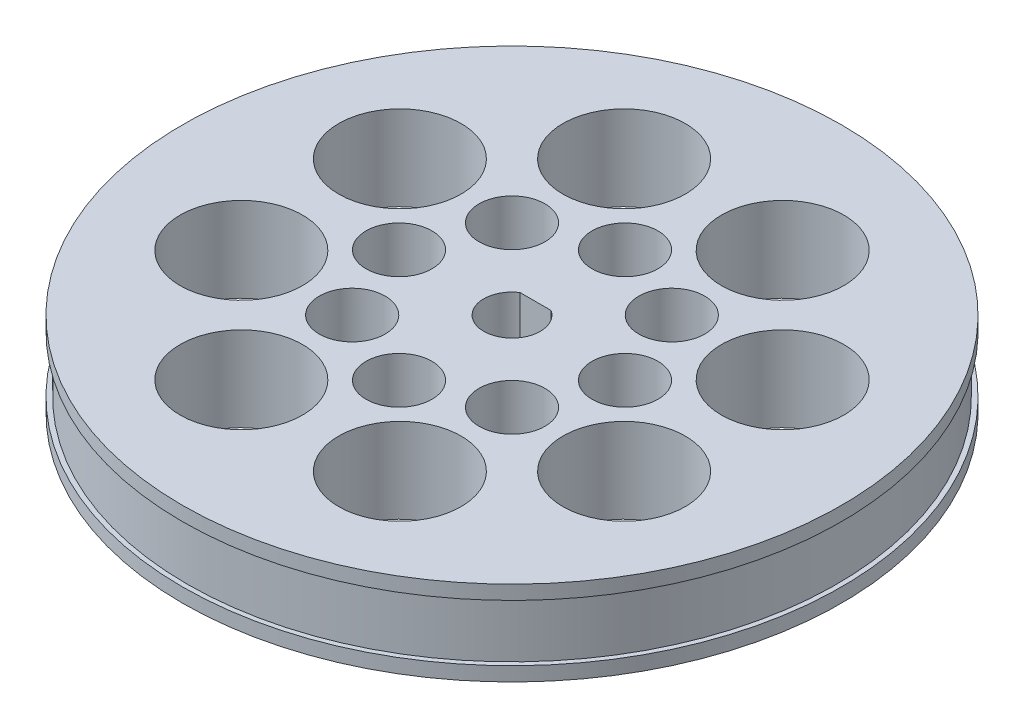
ISO-10303-21;
HEADER;
FILE_DESCRIPTION(('STEP AP214'),'2;1');
FILE_NAME('part.step','',(''),(''),'','','');
FILE_SCHEMA(('AUTOMOTIVE_DESIGN { 1 0 10303 214 1 1 1 1 }'));
ENDSEC;
DATA;
#1=APPLICATION_CONTEXT('core data for automotive mechanical design processes');
#2=APPLICATION_PROTOCOL_DEFINITION('international standard','automotive_design',2000,#1);
#3=PRODUCT_CONTEXT('',#1,'mechanical');
#4=PRODUCT('Part','Part','',(#3));
#5=PRODUCT_RELATED_PRODUCT_CATEGORY('part','',(#4));
#6=PRODUCT_DEFINITION_FORMATION('','',#4);
#7=PRODUCT_DEFINITION_CONTEXT('part definition',#1,'design');
#8=PRODUCT_DEFINITION('design','',#6,#7);
#9=PRODUCT_DEFINITION_SHAPE('','',#8);
#10=(LENGTH_UNIT() NAMED_UNIT(*) SI_UNIT(.MILLI.,.METRE.));
#11=(NAMED_UNIT(*) PLANE_ANGLE_UNIT() SI_UNIT($,.RADIAN.));
#12=(NAMED_UNIT(*) SI_UNIT($,.STERADIAN.) SOLID_ANGLE_UNIT());
#13=UNCERTAINTY_MEASURE_WITH_UNIT(LENGTH_MEASURE(1.E-05),#10,'distance_accuracy_value','');
#14=(GEOMETRIC_REPRESENTATION_CONTEXT(3) GLOBAL_UNCERTAINTY_ASSIGNED_CONTEXT((#13)) GLOBAL_UNIT_ASSIGNED_CONTEXT((#10,
#11,#12)) REPRESENTATION_CONTEXT('',''));
#15=CARTESIAN_POINT('',(0.,0.,0.));
#16=DIRECTION('',(0.,0.,1.));
#17=DIRECTION('',(1.,0.,0.));
#18=AXIS2_PLACEMENT_3D('',#15,#16,#17);
#19=CARTESIAN_POINT('',(0.,9.,0.));
#20=DIRECTION('',(0.,-1.,0.));
#21=DIRECTION('',(0.,0.,-1.));
#22=AXIS2_PLACEMENT_3D('',#19,#20,#21);
#23=CYLINDRICAL_SURFACE('',#22,35.);
#24=CARTESIAN_POINT('',(0.,9.,0.));
#25=DIRECTION('',(0.,1.,0.));
#26=DIRECTION('',(0.,0.,1.));
#27=AXIS2_PLACEMENT_3D('',#24,#25,#26);
#28=CIRCLE('',#27,35.);
#29=CARTESIAN_POINT('',(0.,9.,35.));
#30=VERTEX_POINT('',#29);
#31=EDGE_CURVE('E11',#30,#30,#28,.T.);
#32=ORIENTED_EDGE('',*,*,#31,.F.);
#33=EDGE_LOOP('',(#32));
#34=FACE_BOUND('',#33,.T.);
#35=CARTESIAN_POINT('',(0.,7.5,0.));
#36=DIRECTION('',(0.,-1.,0.));
#37=DIRECTION('',(0.,0.,-1.));
#38=AXIS2_PLACEMENT_3D('',#35,#36,#37);
#39=CIRCLE('',#38,35.);
#40=CARTESIAN_POINT('',(0.,7.5,-35.));
#41=VERTEX_POINT('',#40);
#42=EDGE_CURVE('E37',#41,#41,#39,.T.);
#43=ORIENTED_EDGE('',*,*,#42,.F.);
#44=EDGE_LOOP('',(#43));
#45=FACE_BOUND('',#44,.T.);
#46=ADVANCED_FACE('F34',(#34,#45),#23,.T.);
#47=CARTESIAN_POINT('',(0.,0.,0.));
#48=DIRECTION('',(0.,1.,0.));
#49=DIRECTION('',(0.,0.,1.));
#50=AXIS2_PLACEMENT_3D('',#47,#48,#49);
#51=CIRCLE('',#50,35.);
#52=CARTESIAN_POINT('',(0.,0.,35.));
#53=VERTEX_POINT('',#52);
#54=EDGE_CURVE('E42',#53,#53,#51,.T.);
#55=ORIENTED_EDGE('',*,*,#54,.T.);
#56=EDGE_LOOP('',(#55));
#57=FACE_BOUND('',#56,.T.);
#58=CARTESIAN_POINT('',(0.,1.5,0.));
#59=DIRECTION('',(0.,1.,0.));
#60=DIRECTION('',(0.,0.,1.));
#61=AXIS2_PLACEMENT_3D('',#58,#59,#60);
#62=CIRCLE('',#61,35.);
#63=CARTESIAN_POINT('',(0.,1.5,35.));
#64=VERTEX_POINT('',#63);
#65=EDGE_CURVE('E87',#64,#64,#62,.T.);
#66=ORIENTED_EDGE('',*,*,#65,.F.);
#67=EDGE_LOOP('',(#66));
#68=FACE_BOUND('',#67,.T.);
#69=ADVANCED_FACE('F199',(#57,#68),#23,.T.);
#70=CARTESIAN_POINT('',(0.,9.,0.));
#71=DIRECTION('',(0.,1.,0.));
#72=DIRECTION('',(0.,0.,1.));
#73=AXIS2_PLACEMENT_3D('',#70,#71,#72);
#74=PLANE('',#73);
#75=CARTESIAN_POINT('',(-12.,9.,0.));
#76=DIRECTION('',(0.,1.,0.));
#77=DIRECTION('',(0.,0.,1.));
#78=AXIS2_PLACEMENT_3D('',#75,#76,#77);
#79=CIRCLE('',#78,3.5);
#80=CARTESIAN_POINT('',(-12.,9.,3.49999999999992));
#81=VERTEX_POINT('',#80);
#82=EDGE_CURVE('E75',#81,#81,#79,.T.);
#83=ORIENTED_EDGE('',*,*,#82,.F.);
#84=EDGE_LOOP('',(#83));
#85=FACE_BOUND('',#84,.T.);
#86=CARTESIAN_POINT('',(-20.3253497152483,9.,8.419035512032));
#87=DIRECTION('',(0.,1.,0.));
#88=DIRECTION('',(0.,0.,1.));
#89=AXIS2_PLACEMENT_3D('',#86,#87,#88);
#90=CIRCLE('',#89,6.5);
#91=CARTESIAN_POINT('',(-20.3253497152483,9.,14.919035512032));
#92=VERTEX_POINT('',#91);
#93=EDGE_CURVE('E78',#92,#92,#90,.T.);
#94=ORIENTED_EDGE('',*,*,#93,.F.);
#95=EDGE_LOOP('',(#94));
#96=FACE_BOUND('',#95,.T.);
#97=CARTESIAN_POINT('',(-20.3253497152483,9.,-8.41903551203198));
#98=DIRECTION('',(0.,1.,0.));
#99=DIRECTION('',(0.,0.,1.));
#100=AXIS2_PLACEMENT_3D('',#97,#98,#99);
#101=CIRCLE('',#100,6.5);
#102=CARTESIAN_POINT('',(-20.3253497152483,9.,-1.91903551203198));
#103=VERTEX_POINT('',#102);
#104=EDGE_CURVE('E188',#103,#103,#101,.T.);
#105=ORIENTED_EDGE('',*,*,#104,.F.);
#106=EDGE_LOOP('',(#105));
#107=FACE_BOUND('',#106,.T.);
#108=CARTESIAN_POINT('',(-8.4852813742385,9.,-8.48528137423864));
#109=DIRECTION('',(0.,1.,0.));
#110=DIRECTION('',(0.,0.,1.));
#111=AXIS2_PLACEMENT_3D('',#108,#109,#110);
#112=CIRCLE('',#111,3.5);
#113=CARTESIAN_POINT('',(-8.4852813742385,9.,-4.98528137423864));
#114=VERTEX_POINT('',#113);
#115=EDGE_CURVE('E185',#114,#114,#112,.T.);
#116=ORIENTED_EDGE('',*,*,#115,.F.);
#117=EDGE_LOOP('',(#116));
#118=FACE_BOUND('',#117,.T.);
#119=CARTESIAN_POINT('',(0.,9.,12.));
#120=DIRECTION('',(0.,1.,0.));
#121=DIRECTION('',(0.,0.,1.));
#122=AXIS2_PLACEMENT_3D('',#119,#120,#121);
#123=CIRCLE('',#122,3.5);
#124=CARTESIAN_POINT('',(0.,9.,15.5));
#125=VERTEX_POINT('',#124);
#126=EDGE_CURVE('E182',#125,#125,#123,.T.);
#127=ORIENTED_EDGE('',*,*,#126,.F.);
#128=EDGE_LOOP('',(#127));
#129=FACE_BOUND('',#128,.T.);
#130=CARTESIAN_POINT('',(8.41903551203207,9.,20.3253497152483));
#131=DIRECTION('',(0.,1.,0.));
#132=DIRECTION('',(0.,0.,1.));
#133=AXIS2_PLACEMENT_3D('',#130,#131,#132);
#134=CIRCLE('',#133,6.5);
#135=CARTESIAN_POINT('',(8.41903551203207,9.,26.8253497152483));
#136=VERTEX_POINT('',#135);
#137=EDGE_CURVE('E179',#136,#136,#134,.T.);
#138=ORIENTED_EDGE('',*,*,#137,.F.);
#139=EDGE_LOOP('',(#138));
#140=FACE_BOUND('',#139,.T.);
#141=CARTESIAN_POINT('',(-8.41903551203191,9.,20.3253497152483));
#142=DIRECTION('',(0.,1.,0.));
#143=DIRECTION('',(0.,0.,1.));
#144=AXIS2_PLACEMENT_3D('',#141,#142,#143);
#145=CIRCLE('',#144,6.5);
#146=CARTESIAN_POINT('',(-8.41903551203191,9.,26.8253497152483));
#147=VERTEX_POINT('',#146);
#148=EDGE_CURVE('E176',#147,#147,#145,.T.);
#149=ORIENTED_EDGE('',*,*,#148,.F.);
#150=EDGE_LOOP('',(#149));
#151=FACE_BOUND('',#150,.T.);
#152=CARTESIAN_POINT('',(-8.48528137423861,9.,8.48528137423853));
#153=DIRECTION('',(0.,1.,0.));
#154=DIRECTION('',(0.,0.,1.));
#155=AXIS2_PLACEMENT_3D('',#152,#153,#154);
#156=CIRCLE('',#155,3.5);
#157=CARTESIAN_POINT('',(-8.48528137423861,9.,11.9852813742385));
#158=VERTEX_POINT('',#157);
#159=EDGE_CURVE('E173',#158,#158,#156,.T.);
#160=ORIENTED_EDGE('',*,*,#159,.F.);
#161=EDGE_LOOP('',(#160));
#162=FACE_BOUND('',#161,.T.);
#163=CARTESIAN_POINT('',(12.,9.,1.63931368479808E-13));
#164=DIRECTION('',(0.,1.,0.));
#165=DIRECTION('',(0.,0.,1.));
#166=AXIS2_PLACEMENT_3D('',#163,#164,#165);
#167=CIRCLE('',#166,3.5);
#168=CARTESIAN_POINT('',(12.,9.,3.50000000000017));
#169=VERTEX_POINT('',#168);
#170=EDGE_CURVE('E170',#169,#169,#167,.T.);
#171=ORIENTED_EDGE('',*,*,#170,.F.);
#172=EDGE_LOOP('',(#171));
#173=FACE_BOUND('',#172,.T.);
#174=CARTESIAN_POINT('',(20.3253497152484,9.,-8.41903551203186));
#175=DIRECTION('',(0.,1.,0.));
#176=DIRECTION('',(0.,0.,1.));
#177=AXIS2_PLACEMENT_3D('',#174,#175,#176);
#178=CIRCLE('',#177,6.5);
#179=CARTESIAN_POINT('',(20.3253497152484,9.,-1.91903551203185));
#180=VERTEX_POINT('',#179);
#181=EDGE_CURVE('E167',#180,#180,#178,.T.);
#182=ORIENTED_EDGE('',*,*,#181,.F.);
#183=EDGE_LOOP('',(#182));
#184=FACE_BOUND('',#183,.T.);
#185=CARTESIAN_POINT('',(20.3253497152482,9.,8.41903551203212));
#186=DIRECTION('',(0.,1.,0.));
#187=DIRECTION('',(0.,0.,1.));
#188=AXIS2_PLACEMENT_3D('',#185,#186,#187);
#189=CIRCLE('',#188,6.5);
#190=CARTESIAN_POINT('',(20.3253497152482,9.,14.9190355120321));
#191=VERTEX_POINT('',#190);
#192=EDGE_CURVE('E164',#191,#191,#189,.T.);
#193=ORIENTED_EDGE('',*,*,#192,.F.);
#194=EDGE_LOOP('',(#193));
#195=FACE_BOUND('',#194,.T.);
#196=CARTESIAN_POINT('',(1.24032728532342E-13,9.,-12.));
#197=DIRECTION('',(0.,1.,0.));
#198=DIRECTION('',(0.,0.,1.));
#199=AXIS2_PLACEMENT_3D('',#196,#197,#198);
#200=CIRCLE('',#199,3.5);
#201=CARTESIAN_POINT('',(1.24032728532342E-13,9.,-8.5));
#202=VERTEX_POINT('',#201);
#203=EDGE_CURVE('E161',#202,#202,#200,.T.);
#204=ORIENTED_EDGE('',*,*,#203,.F.);
#205=EDGE_LOOP('',(#204));
#206=FACE_BOUND('',#205,.T.);
#207=CARTESIAN_POINT('',(-8.41903551203193,9.,-20.3253497152483));
#208=DIRECTION('',(0.,1.,0.));
#209=DIRECTION('',(0.,0.,1.));
#210=AXIS2_PLACEMENT_3D('',#207,#208,#209);
#211=CIRCLE('',#210,6.5);
#212=CARTESIAN_POINT('',(-8.41903551203193,9.,-13.8253497152483));
#213=VERTEX_POINT('',#212);
#214=EDGE_CURVE('E158',#213,#213,#211,.T.);
#215=ORIENTED_EDGE('',*,*,#214,.F.);
#216=EDGE_LOOP('',(#215));
#217=FACE_BOUND('',#216,.T.);
#218=CARTESIAN_POINT('',(8.41903551203205,9.,-20.3253497152483));
#219=DIRECTION('',(0.,1.,0.));
#220=DIRECTION('',(0.,0.,1.));
#221=AXIS2_PLACEMENT_3D('',#218,#219,#220);
#222=CIRCLE('',#221,6.5);
#223=CARTESIAN_POINT('',(8.41903551203205,9.,-13.8253497152483));
#224=VERTEX_POINT('',#223);
#225=EDGE_CURVE('E155',#224,#224,#222,.T.);
#226=ORIENTED_EDGE('',*,*,#225,.F.);
#227=EDGE_LOOP('',(#226));
#228=FACE_BOUND('',#227,.T.);
#229=CARTESIAN_POINT('',(8.48528137423867,9.,-8.48528137423847));
#230=DIRECTION('',(0.,1.,0.));
#231=DIRECTION('',(0.,0.,1.));
#232=AXIS2_PLACEMENT_3D('',#229,#230,#231);
#233=CIRCLE('',#232,3.5);
#234=CARTESIAN_POINT('',(8.48528137423867,9.,-4.98528137423847));
#235=VERTEX_POINT('',#234);
#236=EDGE_CURVE('E152',#235,#235,#233,.T.);
#237=ORIENTED_EDGE('',*,*,#236,.F.);
#238=EDGE_LOOP('',(#237));
#239=FACE_BOUND('',#238,.T.);
#240=CARTESIAN_POINT('',(8.48528137423856,9.,8.48528137423858));
#241=DIRECTION('',(0.,1.,0.));
#242=DIRECTION('',(0.,0.,1.));
#243=AXIS2_PLACEMENT_3D('',#240,#241,#242);
#244=CIRCLE('',#243,3.5);
#245=CARTESIAN_POINT('',(8.48528137423856,9.,11.9852813742386));
#246=VERTEX_POINT('',#245);
#247=EDGE_CURVE('E149',#246,#246,#244,.T.);
#248=ORIENTED_EDGE('',*,*,#247,.F.);
#249=EDGE_LOOP('',(#248));
#250=FACE_BOUND('',#249,.T.);
#251=CARTESIAN_POINT('',(0.,9.,0.));
#252=DIRECTION('',(0.,1.,0.));
#253=DIRECTION('',(0.,0.,1.));
#254=AXIS2_PLACEMENT_3D('',#251,#252,#253);
#255=CIRCLE('',#254,3.);
#256=CARTESIAN_POINT('',(-1.6583123951777,9.,-2.5));
#257=VERTEX_POINT('',#256);
#258=CARTESIAN_POINT('',(1.6583123951777,9.,-2.5));
#259=VERTEX_POINT('',#258);
#260=EDGE_CURVE('E70',#257,#259,#255,.T.);
#261=ORIENTED_EDGE('',*,*,#260,.F.);
#262=DIRECTION('',(1.,0.,0.));
#263=VECTOR('',#262,1.);
#264=CARTESIAN_POINT('',(0.,9.,-2.5));
#265=LINE('',#264,#263);
#266=EDGE_CURVE('E82',#257,#259,#265,.T.);
#267=ORIENTED_EDGE('',*,*,#266,.T.);
#268=EDGE_LOOP('',(#261,#267));
#269=FACE_BOUND('',#268,.T.);
#270=ORIENTED_EDGE('',*,*,#31,.T.);
#271=EDGE_LOOP('',(#270));
#272=FACE_BOUND('',#271,.T.);
#273=ADVANCED_FACE('F196',(#85,#96,#107,#118,#129,#140,#151,#162,#173,#184,#195,#206,#217,#228,
#239,#250,#269,#272),#74,.T.);
#274=CARTESIAN_POINT('',(0.,0.,0.));
#275=DIRECTION('',(0.,1.,0.));
#276=DIRECTION('',(0.,0.,1.));
#277=AXIS2_PLACEMENT_3D('',#274,#275,#276);
#278=PLANE('',#277);
#279=CARTESIAN_POINT('',(-12.,0.,0.));
#280=DIRECTION('',(0.,1.,0.));
#281=DIRECTION('',(0.,0.,1.));
#282=AXIS2_PLACEMENT_3D('',#279,#280,#281);
#283=CIRCLE('',#282,3.5);
#284=CARTESIAN_POINT('',(-12.,0.,3.49999999999992));
#285=VERTEX_POINT('',#284);
#286=EDGE_CURVE('E126',#285,#285,#283,.T.);
#287=ORIENTED_EDGE('',*,*,#286,.T.);
#288=EDGE_LOOP('',(#287));
#289=FACE_BOUND('',#288,.T.);
#290=CARTESIAN_POINT('',(-20.3253497152483,0.,8.419035512032));
#291=DIRECTION('',(0.,1.,0.));
#292=DIRECTION('',(0.,0.,1.));
#293=AXIS2_PLACEMENT_3D('',#290,#291,#292);
#294=CIRCLE('',#293,6.5);
#295=CARTESIAN_POINT('',(-20.3253497152483,0.,14.919035512032));
#296=VERTEX_POINT('',#295);
#297=EDGE_CURVE('E131',#296,#296,#294,.T.);
#298=ORIENTED_EDGE('',*,*,#297,.T.);
#299=EDGE_LOOP('',(#298));
#300=FACE_BOUND('',#299,.T.);
#301=CARTESIAN_POINT('',(-20.3253497152483,0.,-8.41903551203198));
#302=DIRECTION('',(0.,1.,0.));
#303=DIRECTION('',(0.,0.,1.));
#304=AXIS2_PLACEMENT_3D('',#301,#302,#303);
#305=CIRCLE('',#304,6.5);
#306=CARTESIAN_POINT('',(-20.3253497152483,0.,-1.91903551203198));
#307=VERTEX_POINT('',#306);
#308=EDGE_CURVE('E123',#307,#307,#305,.T.);
#309=ORIENTED_EDGE('',*,*,#308,.T.);
#310=EDGE_LOOP('',(#309));
#311=FACE_BOUND('',#310,.T.);
#312=CARTESIAN_POINT('',(-8.4852813742385,0.,-8.48528137423864));
#313=DIRECTION('',(0.,1.,0.));
#314=DIRECTION('',(0.,0.,1.));
#315=AXIS2_PLACEMENT_3D('',#312,#313,#314);
#316=CIRCLE('',#315,3.5);
#317=CARTESIAN_POINT('',(-8.4852813742385,0.,-4.98528137423864));
#318=VERTEX_POINT('',#317);
#319=EDGE_CURVE('E122',#318,#318,#316,.T.);
#320=ORIENTED_EDGE('',*,*,#319,.T.);
#321=EDGE_LOOP('',(#320));
#322=FACE_BOUND('',#321,.T.);
#323=CARTESIAN_POINT('',(0.,0.,12.));
#324=DIRECTION('',(0.,1.,0.));
#325=DIRECTION('',(0.,0.,1.));
#326=AXIS2_PLACEMENT_3D('',#323,#324,#325);
#327=CIRCLE('',#326,3.5);
#328=CARTESIAN_POINT('',(0.,0.,15.5));
#329=VERTEX_POINT('',#328);
#330=EDGE_CURVE('E138',#329,#329,#327,.T.);
#331=ORIENTED_EDGE('',*,*,#330,.T.);
#332=EDGE_LOOP('',(#331));
#333=FACE_BOUND('',#332,.T.);
#334=CARTESIAN_POINT('',(8.41903551203207,0.,20.3253497152483));
#335=DIRECTION('',(0.,1.,0.));
#336=DIRECTION('',(0.,0.,1.));
#337=AXIS2_PLACEMENT_3D('',#334,#335,#336);
#338=CIRCLE('',#337,6.5);
#339=CARTESIAN_POINT('',(8.41903551203207,0.,26.8253497152483));
#340=VERTEX_POINT('',#339);
#341=EDGE_CURVE('E143',#340,#340,#338,.T.);
#342=ORIENTED_EDGE('',*,*,#341,.T.);
#343=EDGE_LOOP('',(#342));
#344=FACE_BOUND('',#343,.T.);
#345=CARTESIAN_POINT('',(-8.41903551203191,0.,20.3253497152483));
#346=DIRECTION('',(0.,1.,0.));
#347=DIRECTION('',(0.,0.,1.));
#348=AXIS2_PLACEMENT_3D('',#345,#346,#347);
#349=CIRCLE('',#348,6.5);
#350=CARTESIAN_POINT('',(-8.41903551203191,0.,26.8253497152483));
#351=VERTEX_POINT('',#350);
#352=EDGE_CURVE('E135',#351,#351,#349,.T.);
#353=ORIENTED_EDGE('',*,*,#352,.T.);
#354=EDGE_LOOP('',(#353));
#355=FACE_BOUND('',#354,.T.);
#356=CARTESIAN_POINT('',(-8.48528137423861,0.,8.48528137423853));
#357=DIRECTION('',(0.,1.,0.));
#358=DIRECTION('',(0.,0.,1.));
#359=AXIS2_PLACEMENT_3D('',#356,#357,#358);
#360=CIRCLE('',#359,3.5);
#361=CARTESIAN_POINT('',(-8.48528137423861,0.,11.9852813742385));
#362=VERTEX_POINT('',#361);
#363=EDGE_CURVE('E134',#362,#362,#360,.T.);
#364=ORIENTED_EDGE('',*,*,#363,.T.);
#365=EDGE_LOOP('',(#364));
#366=FACE_BOUND('',#365,.T.);
#367=CARTESIAN_POINT('',(12.,0.,1.63931368479808E-13));
#368=DIRECTION('',(0.,1.,0.));
#369=DIRECTION('',(0.,0.,1.));
#370=AXIS2_PLACEMENT_3D('',#367,#368,#369);
#371=CIRCLE('',#370,3.5);
#372=CARTESIAN_POINT('',(12.,0.,3.50000000000017));
#373=VERTEX_POINT('',#372);
#374=EDGE_CURVE('E104',#373,#373,#371,.T.);
#375=ORIENTED_EDGE('',*,*,#374,.T.);
#376=EDGE_LOOP('',(#375));
#377=FACE_BOUND('',#376,.T.);
#378=CARTESIAN_POINT('',(20.3253497152484,0.,-8.41903551203186));
#379=DIRECTION('',(0.,1.,0.));
#380=DIRECTION('',(0.,0.,1.));
#381=AXIS2_PLACEMENT_3D('',#378,#379,#380);
#382=CIRCLE('',#381,6.5);
#383=CARTESIAN_POINT('',(20.3253497152484,0.,-1.91903551203185));
#384=VERTEX_POINT('',#383);
#385=EDGE_CURVE('E107',#384,#384,#382,.T.);
#386=ORIENTED_EDGE('',*,*,#385,.T.);
#387=EDGE_LOOP('',(#386));
#388=FACE_BOUND('',#387,.T.);
#389=CARTESIAN_POINT('',(20.3253497152482,0.,8.41903551203212));
#390=DIRECTION('',(0.,1.,0.));
#391=DIRECTION('',(0.,0.,1.));
#392=AXIS2_PLACEMENT_3D('',#389,#390,#391);
#393=CIRCLE('',#392,6.5);
#394=CARTESIAN_POINT('',(20.3253497152482,0.,14.9190355120321));
#395=VERTEX_POINT('',#394);
#396=EDGE_CURVE('E93',#395,#395,#393,.T.);
#397=ORIENTED_EDGE('',*,*,#396,.T.);
#398=EDGE_LOOP('',(#397));
#399=FACE_BOUND('',#398,.T.);
#400=CARTESIAN_POINT('',(1.24032728532342E-13,0.,-12.));
#401=DIRECTION('',(0.,1.,0.));
#402=DIRECTION('',(0.,0.,1.));
#403=AXIS2_PLACEMENT_3D('',#400,#401,#402);
#404=CIRCLE('',#403,3.5);
#405=CARTESIAN_POINT('',(1.24032728532342E-13,0.,-8.5));
#406=VERTEX_POINT('',#405);
#407=EDGE_CURVE('E114',#406,#406,#404,.T.);
#408=ORIENTED_EDGE('',*,*,#407,.T.);
#409=EDGE_LOOP('',(#408));
#410=FACE_BOUND('',#409,.T.);
#411=CARTESIAN_POINT('',(-8.41903551203193,0.,-20.3253497152483));
#412=DIRECTION('',(0.,1.,0.));
#413=DIRECTION('',(0.,0.,1.));
#414=AXIS2_PLACEMENT_3D('',#411,#412,#413);
#415=CIRCLE('',#414,6.5);
#416=CARTESIAN_POINT('',(-8.41903551203193,0.,-13.8253497152483));
#417=VERTEX_POINT('',#416);
#418=EDGE_CURVE('E119',#417,#417,#415,.T.);
#419=ORIENTED_EDGE('',*,*,#418,.T.);
#420=EDGE_LOOP('',(#419));
#421=FACE_BOUND('',#420,.T.);
#422=CARTESIAN_POINT('',(8.41903551203205,0.,-20.3253497152483));
#423=DIRECTION('',(0.,1.,0.));
#424=DIRECTION('',(0.,0.,1.));
#425=AXIS2_PLACEMENT_3D('',#422,#423,#424);
#426=CIRCLE('',#425,6.5);
#427=CARTESIAN_POINT('',(8.41903551203205,0.,-13.8253497152483));
#428=VERTEX_POINT('',#427);
#429=EDGE_CURVE('E111',#428,#428,#426,.T.);
#430=ORIENTED_EDGE('',*,*,#429,.T.);
#431=EDGE_LOOP('',(#430));
#432=FACE_BOUND('',#431,.T.);
#433=CARTESIAN_POINT('',(8.48528137423867,0.,-8.48528137423847));
#434=DIRECTION('',(0.,1.,0.));
#435=DIRECTION('',(0.,0.,1.));
#436=AXIS2_PLACEMENT_3D('',#433,#434,#435);
#437=CIRCLE('',#436,3.5);
#438=CARTESIAN_POINT('',(8.48528137423867,0.,-4.98528137423847));
#439=VERTEX_POINT('',#438);
#440=EDGE_CURVE('E110',#439,#439,#437,.T.);
#441=ORIENTED_EDGE('',*,*,#440,.T.);
#442=EDGE_LOOP('',(#441));
#443=FACE_BOUND('',#442,.T.);
#444=CARTESIAN_POINT('',(8.48528137423856,0.,8.48528137423858));
#445=DIRECTION('',(0.,1.,0.));
#446=DIRECTION('',(0.,0.,1.));
#447=AXIS2_PLACEMENT_3D('',#444,#445,#446);
#448=CIRCLE('',#447,3.5);
#449=CARTESIAN_POINT('',(8.48528137423856,0.,11.9852813742386));
#450=VERTEX_POINT('',#449);
#451=EDGE_CURVE('E146',#450,#450,#448,.T.);
#452=ORIENTED_EDGE('',*,*,#451,.T.);
#453=EDGE_LOOP('',(#452));
#454=FACE_BOUND('',#453,.T.);
#455=DIRECTION('',(1.,0.,0.));
#456=VECTOR('',#455,1.);
#457=CARTESIAN_POINT('',(-1.6583123951777,0.,-2.5));
#458=LINE('',#457,#456);
#459=CARTESIAN_POINT('',(-1.6583123951777,0.,-2.5));
#460=VERTEX_POINT('',#459);
#461=CARTESIAN_POINT('',(1.6583123951777,0.,-2.5));
#462=VERTEX_POINT('',#461);
#463=EDGE_CURVE('E63',#460,#462,#458,.T.);
#464=ORIENTED_EDGE('',*,*,#463,.F.);
#465=CARTESIAN_POINT('',(0.,0.,0.));
#466=DIRECTION('',(0.,1.,0.));
#467=DIRECTION('',(0.,0.,1.));
#468=AXIS2_PLACEMENT_3D('',#465,#466,#467);
#469=CIRCLE('',#468,3.);
#470=EDGE_CURVE('E58',#460,#462,#469,.T.);
#471=ORIENTED_EDGE('',*,*,#470,.T.);
#472=EDGE_LOOP('',(#464,#471));
#473=FACE_BOUND('',#472,.T.);
#474=ORIENTED_EDGE('',*,*,#54,.F.);
#475=EDGE_LOOP('',(#474));
#476=FACE_BOUND('',#475,.T.);
#477=ADVANCED_FACE('F73',(#289,#300,#311,#322,#333,#344,#355,#366,#377,#388,#399,#410,#421,#432,
#443,#454,#473,#476),#278,.F.);
#478=CARTESIAN_POINT('',(0.,0.,0.));
#479=DIRECTION('',(0.,1.,0.));
#480=DIRECTION('',(0.,0.,1.));
#481=AXIS2_PLACEMENT_3D('',#478,#479,#480);
#482=CYLINDRICAL_SURFACE('',#481,3.);
#483=ORIENTED_EDGE('',*,*,#260,.T.);
#484=DIRECTION('',(0.,1.,0.));
#485=VECTOR('',#484,1.);
#486=CARTESIAN_POINT('',(1.6583123951777,0.,-2.5));
#487=LINE('',#486,#485);
#488=EDGE_CURVE('E50',#462,#259,#487,.T.);
#489=ORIENTED_EDGE('',*,*,#488,.F.);
#490=ORIENTED_EDGE('',*,*,#470,.F.);
#491=DIRECTION('',(0.,1.,0.));
#492=VECTOR('',#491,1.);
#493=CARTESIAN_POINT('',(-1.6583123951777,0.,-2.5));
#494=LINE('',#493,#492);
#495=EDGE_CURVE('E65',#460,#257,#494,.T.);
#496=ORIENTED_EDGE('',*,*,#495,.T.);
#497=EDGE_LOOP('',(#483,#489,#490,#496));
#498=FACE_BOUND('',#497,.T.);
#499=ADVANCED_FACE('F68',(#498),#482,.F.);
#500=CARTESIAN_POINT('',(-1.6583123951777,0.,-2.5));
#501=DIRECTION('',(0.,0.,1.));
#502=DIRECTION('',(1.,0.,0.));
#503=AXIS2_PLACEMENT_3D('',#500,#501,#502);
#504=PLANE('',#503);
#505=ORIENTED_EDGE('',*,*,#495,.F.);
#506=ORIENTED_EDGE('',*,*,#463,.T.);
#507=ORIENTED_EDGE('',*,*,#488,.T.);
#508=ORIENTED_EDGE('',*,*,#266,.F.);
#509=EDGE_LOOP('',(#505,#506,#507,#508));
#510=FACE_BOUND('',#509,.T.);
#511=ADVANCED_FACE('F64',(#510),#504,.T.);
#512=CARTESIAN_POINT('',(8.48528137423856,0.,8.48528137423858));
#513=DIRECTION('',(0.,1.,0.));
#514=DIRECTION('',(0.,0.,1.));
#515=AXIS2_PLACEMENT_3D('',#512,#513,#514);
#516=CYLINDRICAL_SURFACE('',#515,3.5);
#517=ORIENTED_EDGE('',*,*,#247,.T.);
#518=EDGE_LOOP('',(#517));
#519=FACE_BOUND('',#518,.T.);
#520=ORIENTED_EDGE('',*,*,#451,.F.);
#521=EDGE_LOOP('',(#520));
#522=FACE_BOUND('',#521,.T.);
#523=ADVANCED_FACE('F275',(#519,#522),#516,.F.);
#524=CARTESIAN_POINT('',(8.48528137423867,0.,-8.48528137423847));
#525=DIRECTION('',(0.,1.,0.));
#526=DIRECTION('',(0.,0.,1.));
#527=AXIS2_PLACEMENT_3D('',#524,#525,#526);
#528=CYLINDRICAL_SURFACE('',#527,3.5);
#529=ORIENTED_EDGE('',*,*,#236,.T.);
#530=EDGE_LOOP('',(#529));
#531=FACE_BOUND('',#530,.T.);
#532=ORIENTED_EDGE('',*,*,#440,.F.);
#533=EDGE_LOOP('',(#532));
#534=FACE_BOUND('',#533,.T.);
#535=ADVANCED_FACE('F271',(#531,#534),#528,.F.);
#536=CARTESIAN_POINT('',(8.41903551203205,0.,-20.3253497152483));
#537=DIRECTION('',(0.,1.,0.));
#538=DIRECTION('',(0.,0.,1.));
#539=AXIS2_PLACEMENT_3D('',#536,#537,#538);
#540=CYLINDRICAL_SURFACE('',#539,6.5);
#541=ORIENTED_EDGE('',*,*,#225,.T.);
#542=EDGE_LOOP('',(#541));
#543=FACE_BOUND('',#542,.T.);
#544=ORIENTED_EDGE('',*,*,#429,.F.);
#545=EDGE_LOOP('',(#544));
#546=FACE_BOUND('',#545,.T.);
#547=ADVANCED_FACE('F267',(#543,#546),#540,.F.);
#548=CARTESIAN_POINT('',(-8.41903551203193,0.,-20.3253497152483));
#549=DIRECTION('',(0.,1.,0.));
#550=DIRECTION('',(0.,0.,1.));
#551=AXIS2_PLACEMENT_3D('',#548,#549,#550);
#552=CYLINDRICAL_SURFACE('',#551,6.5);
#553=ORIENTED_EDGE('',*,*,#214,.T.);
#554=EDGE_LOOP('',(#553));
#555=FACE_BOUND('',#554,.T.);
#556=ORIENTED_EDGE('',*,*,#418,.F.);
#557=EDGE_LOOP('',(#556));
#558=FACE_BOUND('',#557,.T.);
#559=ADVANCED_FACE('F270',(#555,#558),#552,.F.);
#560=CARTESIAN_POINT('',(1.24032728532342E-13,0.,-12.));
#561=DIRECTION('',(0.,1.,0.));
#562=DIRECTION('',(0.,0.,1.));
#563=AXIS2_PLACEMENT_3D('',#560,#561,#562);
#564=CYLINDRICAL_SURFACE('',#563,3.5);
#565=ORIENTED_EDGE('',*,*,#203,.T.);
#566=EDGE_LOOP('',(#565));
#567=FACE_BOUND('',#566,.T.);
#568=ORIENTED_EDGE('',*,*,#407,.F.);
#569=EDGE_LOOP('',(#568));
#570=FACE_BOUND('',#569,.T.);
#571=ADVANCED_FACE('F257',(#567,#570),#564,.F.);
#572=CARTESIAN_POINT('',(20.3253497152482,0.,8.41903551203212));
#573=DIRECTION('',(0.,1.,0.));
#574=DIRECTION('',(0.,0.,1.));
#575=AXIS2_PLACEMENT_3D('',#572,#573,#574);
#576=CYLINDRICAL_SURFACE('',#575,6.5);
#577=ORIENTED_EDGE('',*,*,#192,.T.);
#578=EDGE_LOOP('',(#577));
#579=FACE_BOUND('',#578,.T.);
#580=ORIENTED_EDGE('',*,*,#396,.F.);
#581=EDGE_LOOP('',(#580));
#582=FACE_BOUND('',#581,.T.);
#583=ADVANCED_FACE('F253',(#579,#582),#576,.F.);
#584=CARTESIAN_POINT('',(20.3253497152484,0.,-8.41903551203186));
#585=DIRECTION('',(0.,1.,0.));
#586=DIRECTION('',(0.,0.,1.));
#587=AXIS2_PLACEMENT_3D('',#584,#585,#586);
#588=CYLINDRICAL_SURFACE('',#587,6.5);
#589=ORIENTED_EDGE('',*,*,#181,.T.);
#590=EDGE_LOOP('',(#589));
#591=FACE_BOUND('',#590,.T.);
#592=ORIENTED_EDGE('',*,*,#385,.F.);
#593=EDGE_LOOP('',(#592));
#594=FACE_BOUND('',#593,.T.);
#595=ADVANCED_FACE('F256',(#591,#594),#588,.F.);
#596=CARTESIAN_POINT('',(12.,0.,1.63931368479808E-13));
#597=DIRECTION('',(0.,1.,0.));
#598=DIRECTION('',(0.,0.,1.));
#599=AXIS2_PLACEMENT_3D('',#596,#597,#598);
#600=CYLINDRICAL_SURFACE('',#599,3.5);
#601=ORIENTED_EDGE('',*,*,#170,.T.);
#602=EDGE_LOOP('',(#601));
#603=FACE_BOUND('',#602,.T.);
#604=ORIENTED_EDGE('',*,*,#374,.F.);
#605=EDGE_LOOP('',(#604));
#606=FACE_BOUND('',#605,.T.);
#607=ADVANCED_FACE('F259',(#603,#606),#600,.F.);
#608=CARTESIAN_POINT('',(-8.48528137423861,0.,8.48528137423853));
#609=DIRECTION('',(0.,1.,0.));
#610=DIRECTION('',(0.,0.,1.));
#611=AXIS2_PLACEMENT_3D('',#608,#609,#610);
#612=CYLINDRICAL_SURFACE('',#611,3.5);
#613=ORIENTED_EDGE('',*,*,#159,.T.);
#614=EDGE_LOOP('',(#613));
#615=FACE_BOUND('',#614,.T.);
#616=ORIENTED_EDGE('',*,*,#363,.F.);
#617=EDGE_LOOP('',(#616));
#618=FACE_BOUND('',#617,.T.);
#619=ADVANCED_FACE('F262',(#615,#618),#612,.F.);
#620=CARTESIAN_POINT('',(-8.41903551203191,0.,20.3253497152483));
#621=DIRECTION('',(0.,1.,0.));
#622=DIRECTION('',(0.,0.,1.));
#623=AXIS2_PLACEMENT_3D('',#620,#621,#622);
#624=CYLINDRICAL_SURFACE('',#623,6.5);
#625=ORIENTED_EDGE('',*,*,#148,.T.);
#626=EDGE_LOOP('',(#625));
#627=FACE_BOUND('',#626,.T.);
#628=ORIENTED_EDGE('',*,*,#352,.F.);
#629=EDGE_LOOP('',(#628));
#630=FACE_BOUND('',#629,.T.);
#631=ADVANCED_FACE('F294',(#627,#630),#624,.F.);
#632=CARTESIAN_POINT('',(8.41903551203207,0.,20.3253497152483));
#633=DIRECTION('',(0.,1.,0.));
#634=DIRECTION('',(0.,0.,1.));
#635=AXIS2_PLACEMENT_3D('',#632,#633,#634);
#636=CYLINDRICAL_SURFACE('',#635,6.5);
#637=ORIENTED_EDGE('',*,*,#137,.T.);
#638=EDGE_LOOP('',(#637));
#639=FACE_BOUND('',#638,.T.);
#640=ORIENTED_EDGE('',*,*,#341,.F.);
#641=EDGE_LOOP('',(#640));
#642=FACE_BOUND('',#641,.T.);
#643=ADVANCED_FACE('F297',(#639,#642),#636,.F.);
#644=CARTESIAN_POINT('',(0.,0.,12.));
#645=DIRECTION('',(0.,1.,0.));
#646=DIRECTION('',(0.,0.,1.));
#647=AXIS2_PLACEMENT_3D('',#644,#645,#646);
#648=CYLINDRICAL_SURFACE('',#647,3.5);
#649=ORIENTED_EDGE('',*,*,#126,.T.);
#650=EDGE_LOOP('',(#649));
#651=FACE_BOUND('',#650,.T.);
#652=ORIENTED_EDGE('',*,*,#330,.F.);
#653=EDGE_LOOP('',(#652));
#654=FACE_BOUND('',#653,.T.);
#655=ADVANCED_FACE('F289',(#651,#654),#648,.F.);
#656=CARTESIAN_POINT('',(-8.4852813742385,0.,-8.48528137423864));
#657=DIRECTION('',(0.,1.,0.));
#658=DIRECTION('',(0.,0.,1.));
#659=AXIS2_PLACEMENT_3D('',#656,#657,#658);
#660=CYLINDRICAL_SURFACE('',#659,3.5);
#661=ORIENTED_EDGE('',*,*,#115,.T.);
#662=EDGE_LOOP('',(#661));
#663=FACE_BOUND('',#662,.T.);
#664=ORIENTED_EDGE('',*,*,#319,.F.);
#665=EDGE_LOOP('',(#664));
#666=FACE_BOUND('',#665,.T.);
#667=ADVANCED_FACE('F286',(#663,#666),#660,.F.);
#668=CARTESIAN_POINT('',(-20.3253497152483,0.,-8.41903551203198));
#669=DIRECTION('',(0.,1.,0.));
#670=DIRECTION('',(0.,0.,1.));
#671=AXIS2_PLACEMENT_3D('',#668,#669,#670);
#672=CYLINDRICAL_SURFACE('',#671,6.5);
#673=ORIENTED_EDGE('',*,*,#104,.T.);
#674=EDGE_LOOP('',(#673));
#675=FACE_BOUND('',#674,.T.);
#676=ORIENTED_EDGE('',*,*,#308,.F.);
#677=EDGE_LOOP('',(#676));
#678=FACE_BOUND('',#677,.T.);
#679=ADVANCED_FACE('F283',(#675,#678),#672,.F.);
#680=CARTESIAN_POINT('',(-20.3253497152483,0.,8.419035512032));
#681=DIRECTION('',(0.,1.,0.));
#682=DIRECTION('',(0.,0.,1.));
#683=AXIS2_PLACEMENT_3D('',#680,#681,#682);
#684=CYLINDRICAL_SURFACE('',#683,6.5);
#685=ORIENTED_EDGE('',*,*,#93,.T.);
#686=EDGE_LOOP('',(#685));
#687=FACE_BOUND('',#686,.T.);
#688=ORIENTED_EDGE('',*,*,#297,.F.);
#689=EDGE_LOOP('',(#688));
#690=FACE_BOUND('',#689,.T.);
#691=ADVANCED_FACE('F193',(#687,#690),#684,.F.);
#692=CARTESIAN_POINT('',(-12.,0.,0.));
#693=DIRECTION('',(0.,1.,0.));
#694=DIRECTION('',(0.,0.,1.));
#695=AXIS2_PLACEMENT_3D('',#692,#693,#694);
#696=CYLINDRICAL_SURFACE('',#695,3.5);
#697=ORIENTED_EDGE('',*,*,#82,.T.);
#698=EDGE_LOOP('',(#697));
#699=FACE_BOUND('',#698,.T.);
#700=ORIENTED_EDGE('',*,*,#286,.F.);
#701=EDGE_LOOP('',(#700));
#702=FACE_BOUND('',#701,.T.);
#703=ADVANCED_FACE('F240',(#699,#702),#696,.F.);
#704=CARTESIAN_POINT('',(0.,7.5,-34.5));
#705=DIRECTION('',(0.,-1.,0.));
#706=DIRECTION('',(0.,0.,-1.));
#707=AXIS2_PLACEMENT_3D('',#704,#705,#706);
#708=PLANE('',#707);
#709=CARTESIAN_POINT('',(0.,7.5,0.));
#710=DIRECTION('',(0.,1.,0.));
#711=DIRECTION('',(0.,0.,1.));
#712=AXIS2_PLACEMENT_3D('',#709,#710,#711);
#713=CIRCLE('',#712,34.5);
#714=CARTESIAN_POINT('',(0.,7.5,34.5));
#715=VERTEX_POINT('',#714);
#716=EDGE_CURVE('E89',#715,#715,#713,.T.);
#717=ORIENTED_EDGE('',*,*,#716,.T.);
#718=EDGE_LOOP('',(#717));
#719=FACE_BOUND('',#718,.T.);
#720=ORIENTED_EDGE('',*,*,#42,.T.);
#721=EDGE_LOOP('',(#720));
#722=FACE_BOUND('',#721,.T.);
#723=ADVANCED_FACE('F237',(#719,#722),#708,.T.);
#724=CARTESIAN_POINT('',(0.,1.5,-34.5));
#725=DIRECTION('',(0.,1.,0.));
#726=DIRECTION('',(0.,0.,1.));
#727=AXIS2_PLACEMENT_3D('',#724,#725,#726);
#728=PLANE('',#727);
#729=CARTESIAN_POINT('',(0.,1.5,0.));
#730=DIRECTION('',(0.,1.,0.));
#731=DIRECTION('',(0.,0.,1.));
#732=AXIS2_PLACEMENT_3D('',#729,#730,#731);
#733=CIRCLE('',#732,34.5);
#734=CARTESIAN_POINT('',(0.,1.5,34.5));
#735=VERTEX_POINT('',#734);
#736=EDGE_CURVE('E95',#735,#735,#733,.T.);
#737=ORIENTED_EDGE('',*,*,#736,.F.);
#738=EDGE_LOOP('',(#737));
#739=FACE_BOUND('',#738,.T.);
#740=ORIENTED_EDGE('',*,*,#65,.T.);
#741=EDGE_LOOP('',(#740));
#742=FACE_BOUND('',#741,.T.);
#743=ADVANCED_FACE('F239',(#739,#742),#728,.T.);
#744=CARTESIAN_POINT('',(0.,9.,0.));
#745=DIRECTION('',(0.,1.,0.));
#746=DIRECTION('',(0.,0.,1.));
#747=AXIS2_PLACEMENT_3D('',#744,#745,#746);
#748=CYLINDRICAL_SURFACE('',#747,34.5);
#749=ORIENTED_EDGE('',*,*,#736,.T.);
#750=EDGE_LOOP('',(#749));
#751=FACE_BOUND('',#750,.T.);
#752=ORIENTED_EDGE('',*,*,#716,.F.);
#753=EDGE_LOOP('',(#752));
#754=FACE_BOUND('',#753,.T.);
#755=ADVANCED_FACE('F246',(#751,#754),#748,.T.);
#756=CLOSED_SHELL('',(#46,#69,#273,#477,#499,#511,#523,#535,#547,#559,#571,#583,#595,#607,#619,
#631,#643,#655,#667,#679,#691,#703,#723,#743,#755));
#757=MANIFOLD_SOLID_BREP('B2',#756);
#758=ADVANCED_BREP_SHAPE_REPRESENTATION('',(#18,#757),#14);
#759=SHAPE_DEFINITION_REPRESENTATION(#9,#758);
ENDSEC;
END-ISO-10303-21;
